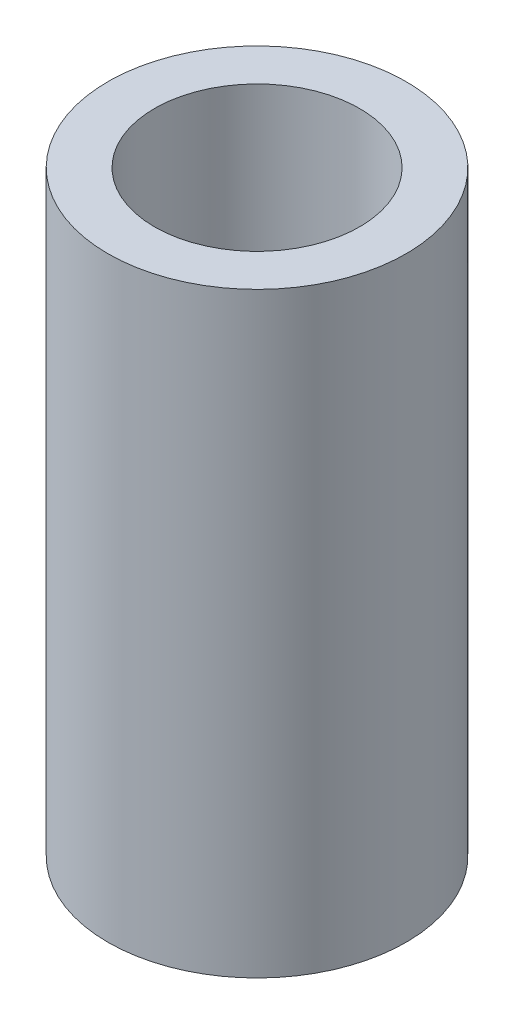
ISO-10303-21;
HEADER;
FILE_DESCRIPTION(('STEP AP214'),'2;1');
FILE_NAME('part.step','',(''),(''),'','','');
FILE_SCHEMA(('AUTOMOTIVE_DESIGN { 1 0 10303 214 1 1 1 1 }'));
ENDSEC;
DATA;
#1=APPLICATION_CONTEXT('core data for automotive mechanical design processes');
#2=APPLICATION_PROTOCOL_DEFINITION('international standard','automotive_design',2000,#1);
#3=PRODUCT_CONTEXT('',#1,'mechanical');
#4=PRODUCT('Part','Part','',(#3));
#5=PRODUCT_RELATED_PRODUCT_CATEGORY('part','',(#4));
#6=PRODUCT_DEFINITION_FORMATION('','',#4);
#7=PRODUCT_DEFINITION_CONTEXT('part definition',#1,'design');
#8=PRODUCT_DEFINITION('design','',#6,#7);
#9=PRODUCT_DEFINITION_SHAPE('','',#8);
#10=(LENGTH_UNIT() NAMED_UNIT(*) SI_UNIT(.MILLI.,.METRE.));
#11=(NAMED_UNIT(*) PLANE_ANGLE_UNIT() SI_UNIT($,.RADIAN.));
#12=(NAMED_UNIT(*) SI_UNIT($,.STERADIAN.) SOLID_ANGLE_UNIT());
#13=UNCERTAINTY_MEASURE_WITH_UNIT(LENGTH_MEASURE(1.E-05),#10,'distance_accuracy_value','');
#14=(GEOMETRIC_REPRESENTATION_CONTEXT(3) GLOBAL_UNCERTAINTY_ASSIGNED_CONTEXT((#13)) GLOBAL_UNIT_ASSIGNED_CONTEXT((#10,
#11,#12)) REPRESENTATION_CONTEXT('',''));
#15=CARTESIAN_POINT('',(0.,0.,0.));
#16=DIRECTION('',(0.,0.,1.));
#17=DIRECTION('',(1.,0.,0.));
#18=AXIS2_PLACEMENT_3D('',#15,#16,#17);
#19=CARTESIAN_POINT('',(0.,6.35,0.));
#20=DIRECTION('',(0.,-1.,0.));
#21=DIRECTION('',(0.,0.,-1.));
#22=AXIS2_PLACEMENT_3D('',#19,#20,#21);
#23=CYLINDRICAL_SURFACE('',#22,1.5875);
#24=CARTESIAN_POINT('',(0.,6.35,0.));
#25=DIRECTION('',(0.,1.,0.));
#26=DIRECTION('',(0.,0.,1.));
#27=AXIS2_PLACEMENT_3D('',#24,#25,#26);
#28=CIRCLE('',#27,1.5875);
#29=CARTESIAN_POINT('',(0.,6.35,1.5875));
#30=VERTEX_POINT('',#29);
#31=EDGE_CURVE('E10',#30,#30,#28,.T.);
#32=ORIENTED_EDGE('',*,*,#31,.F.);
#33=EDGE_LOOP('',(#32));
#34=FACE_BOUND('',#33,.T.);
#35=CARTESIAN_POINT('',(0.,0.,0.));
#36=DIRECTION('',(0.,1.,0.));
#37=DIRECTION('',(0.,0.,1.));
#38=AXIS2_PLACEMENT_3D('',#35,#36,#37);
#39=CIRCLE('',#38,1.5875);
#40=CARTESIAN_POINT('',(0.,0.,1.5875));
#41=VERTEX_POINT('',#40);
#42=EDGE_CURVE('E34',#41,#41,#39,.T.);
#43=ORIENTED_EDGE('',*,*,#42,.T.);
#44=EDGE_LOOP('',(#43));
#45=FACE_BOUND('',#44,.T.);
#46=ADVANCED_FACE('F31',(#34,#45),#23,.T.);
#47=CARTESIAN_POINT('',(0.,6.35,0.));
#48=DIRECTION('',(0.,1.,0.));
#49=DIRECTION('',(0.,0.,1.));
#50=AXIS2_PLACEMENT_3D('',#47,#48,#49);
#51=PLANE('',#50);
#52=CARTESIAN_POINT('',(0.,6.35,0.));
#53=DIRECTION('',(0.,1.,0.));
#54=DIRECTION('',(0.,0.,1.));
#55=AXIS2_PLACEMENT_3D('',#52,#53,#54);
#56=CIRCLE('',#55,1.09219999999999);
#57=CARTESIAN_POINT('',(0.,6.35,1.09219999999999));
#58=VERTEX_POINT('',#57);
#59=EDGE_CURVE('E45',#58,#58,#56,.T.);
#60=ORIENTED_EDGE('',*,*,#59,.F.);
#61=EDGE_LOOP('',(#60));
#62=FACE_BOUND('',#61,.T.);
#63=ORIENTED_EDGE('',*,*,#31,.T.);
#64=EDGE_LOOP('',(#63));
#65=FACE_BOUND('',#64,.T.);
#66=ADVANCED_FACE('F51',(#62,#65),#51,.T.);
#67=CARTESIAN_POINT('',(0.,0.,0.));
#68=DIRECTION('',(0.,1.,0.));
#69=DIRECTION('',(0.,0.,1.));
#70=AXIS2_PLACEMENT_3D('',#67,#68,#69);
#71=PLANE('',#70);
#72=CARTESIAN_POINT('',(0.,0.,0.));
#73=DIRECTION('',(0.,1.,0.));
#74=DIRECTION('',(0.,0.,1.));
#75=AXIS2_PLACEMENT_3D('',#72,#73,#74);
#76=CIRCLE('',#75,1.0922);
#77=CARTESIAN_POINT('',(0.,0.,1.0922));
#78=VERTEX_POINT('',#77);
#79=EDGE_CURVE('E41',#78,#78,#76,.T.);
#80=ORIENTED_EDGE('',*,*,#79,.T.);
#81=EDGE_LOOP('',(#80));
#82=FACE_BOUND('',#81,.T.);
#83=ORIENTED_EDGE('',*,*,#42,.F.);
#84=EDGE_LOOP('',(#83));
#85=FACE_BOUND('',#84,.T.);
#86=ADVANCED_FACE('F53',(#82,#85),#71,.F.);
#87=CARTESIAN_POINT('',(0.,6.35,0.));
#88=DIRECTION('',(0.,1.,0.));
#89=DIRECTION('',(0.,0.,1.));
#90=AXIS2_PLACEMENT_3D('',#87,#88,#89);
#91=CYLINDRICAL_SURFACE('',#90,1.09219999999999);
#92=ORIENTED_EDGE('',*,*,#79,.F.);
#93=EDGE_LOOP('',(#92));
#94=FACE_BOUND('',#93,.T.);
#95=ORIENTED_EDGE('',*,*,#59,.T.);
#96=EDGE_LOOP('',(#95));
#97=FACE_BOUND('',#96,.T.);
#98=ADVANCED_FACE('F49',(#94,#97),#91,.F.);
#99=CLOSED_SHELL('',(#46,#66,#86,#98));
#100=MANIFOLD_SOLID_BREP('B2',#99);
#101=ADVANCED_BREP_SHAPE_REPRESENTATION('',(#18,#100),#14);
#102=SHAPE_DEFINITION_REPRESENTATION(#9,#101);
ENDSEC;
END-ISO-10303-21;
